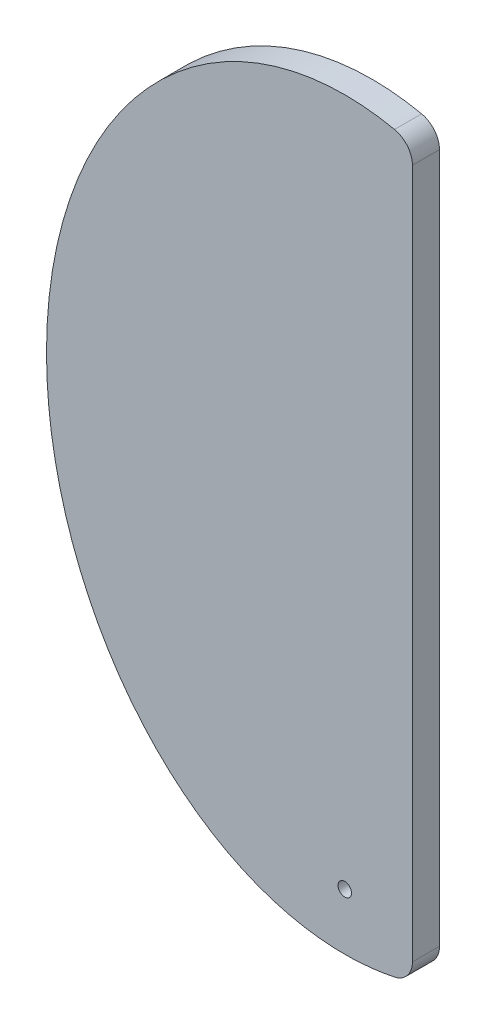
ISO-10303-21;
HEADER;
FILE_DESCRIPTION(('STEP AP214'),'2;1');
FILE_NAME('part.step','',(''),(''),'','','');
FILE_SCHEMA(('AUTOMOTIVE_DESIGN { 1 0 10303 214 1 1 1 1 }'));
ENDSEC;
DATA;
#1=APPLICATION_CONTEXT('core data for automotive mechanical design processes');
#2=APPLICATION_PROTOCOL_DEFINITION('international standard','automotive_design',2000,#1);
#3=PRODUCT_CONTEXT('',#1,'mechanical');
#4=PRODUCT('Part','Part','',(#3));
#5=PRODUCT_RELATED_PRODUCT_CATEGORY('part','',(#4));
#6=PRODUCT_DEFINITION_FORMATION('','',#4);
#7=PRODUCT_DEFINITION_CONTEXT('part definition',#1,'design');
#8=PRODUCT_DEFINITION('design','',#6,#7);
#9=PRODUCT_DEFINITION_SHAPE('','',#8);
#10=(LENGTH_UNIT() NAMED_UNIT(*) SI_UNIT(.MILLI.,.METRE.));
#11=(NAMED_UNIT(*) PLANE_ANGLE_UNIT() SI_UNIT($,.RADIAN.));
#12=(NAMED_UNIT(*) SI_UNIT($,.STERADIAN.) SOLID_ANGLE_UNIT());
#13=UNCERTAINTY_MEASURE_WITH_UNIT(LENGTH_MEASURE(1.E-05),#10,'distance_accuracy_value','');
#14=(GEOMETRIC_REPRESENTATION_CONTEXT(3) GLOBAL_UNCERTAINTY_ASSIGNED_CONTEXT((#13)) GLOBAL_UNIT_ASSIGNED_CONTEXT((#10,
#11,#12)) REPRESENTATION_CONTEXT('',''));
#15=CARTESIAN_POINT('',(0.,0.,0.));
#16=DIRECTION('',(0.,0.,1.));
#17=DIRECTION('',(1.,0.,0.));
#18=AXIS2_PLACEMENT_3D('',#15,#16,#17);
#19=CARTESIAN_POINT('',(0.,0.,6.));
#20=DIRECTION('',(0.,0.,1.));
#21=DIRECTION('',(1.,0.,0.));
#22=AXIS2_PLACEMENT_3D('',#19,#20,#21);
#23=PLANE('',#22);
#24=DIRECTION('',(0.,-1.,0.));
#25=VECTOR('',#24,1.);
#26=CARTESIAN_POINT('',(15.,-139.2756568236,6.));
#27=LINE('',#26,#25);
#28=CARTESIAN_POINT('',(15.,76.4505554366876,6.));
#29=VERTEX_POINT('',#28);
#30=CARTESIAN_POINT('',(15.,-76.4505554366876,6.));
#31=VERTEX_POINT('',#30);
#32=EDGE_CURVE('E110',#29,#31,#27,.T.);
#33=ORIENTED_EDGE('',*,*,#32,.F.);
#34=CARTESIAN_POINT('',(9.99999999999999,76.4505554366876,6.));
#35=DIRECTION('',(0.,0.,1.));
#36=DIRECTION('',(1.,0.,0.));
#37=AXIS2_PLACEMENT_3D('',#34,#35,#36);
#38=CIRCLE('',#37,5.);
#39=CARTESIAN_POINT('',(11.0336642629133,81.3425425780828,6.));
#40=VERTEX_POINT('',#39);
#41=EDGE_CURVE('E11',#29,#40,#38,.T.);
#42=ORIENTED_EDGE('',*,*,#41,.T.);
#43=CARTESIAN_POINT('',(0.,0.,6.));
#44=DIRECTION('',(0.,0.,1.));
#45=DIRECTION('',(0.,-1.,0.));
#46=AXIS2_PLACEMENT_3D('',#43,#44,#45);
#47=ELLIPSE('',#46,82.5,66.1009744717116);
#48=CARTESIAN_POINT('',(11.0336642629133,-81.3425425780828,6.));
#49=VERTEX_POINT('',#48);
#50=EDGE_CURVE('E89',#40,#49,#47,.T.);
#51=ORIENTED_EDGE('',*,*,#50,.T.);
#52=CARTESIAN_POINT('',(10.,-76.4505554366876,6.));
#53=DIRECTION('',(0.,0.,1.));
#54=DIRECTION('',(1.,0.,0.));
#55=AXIS2_PLACEMENT_3D('',#52,#53,#54);
#56=CIRCLE('',#55,5.);
#57=EDGE_CURVE('E40',#49,#31,#56,.T.);
#58=ORIENTED_EDGE('',*,*,#57,.T.);
#59=EDGE_LOOP('',(#33,#42,#51,#58));
#60=FACE_BOUND('',#59,.T.);
#61=CARTESIAN_POINT('',(0.,-70.,6.));
#62=DIRECTION('',(0.,0.,1.));
#63=DIRECTION('',(1.,0.,0.));
#64=AXIS2_PLACEMENT_3D('',#61,#62,#63);
#65=CIRCLE('',#64,1.5);
#66=CARTESIAN_POINT('',(1.50000000000002,-70.,6.));
#67=VERTEX_POINT('',#66);
#68=EDGE_CURVE('E95',#67,#67,#65,.T.);
#69=ORIENTED_EDGE('',*,*,#68,.F.);
#70=EDGE_LOOP('',(#69));
#71=FACE_BOUND('',#70,.T.);
#72=ADVANCED_FACE('F32',(#60,#71),#23,.T.);
#73=CARTESIAN_POINT('',(0.,0.,0.));
#74=DIRECTION('',(0.,0.,1.));
#75=DIRECTION('',(1.,0.,0.));
#76=AXIS2_PLACEMENT_3D('',#73,#74,#75);
#77=PLANE('',#76);
#78=CARTESIAN_POINT('',(0.,0.,0.));
#79=DIRECTION('',(0.,0.,1.));
#80=DIRECTION('',(0.,-1.,0.));
#81=AXIS2_PLACEMENT_3D('',#78,#79,#80);
#82=ELLIPSE('',#81,82.5,66.1009744717116);
#83=CARTESIAN_POINT('',(11.0336642629133,81.3425425780828,0.));
#84=VERTEX_POINT('',#83);
#85=CARTESIAN_POINT('',(11.0336642629133,-81.3425425780828,0.));
#86=VERTEX_POINT('',#85);
#87=EDGE_CURVE('E87',#84,#86,#82,.T.);
#88=ORIENTED_EDGE('',*,*,#87,.F.);
#89=CARTESIAN_POINT('',(9.99999999999999,76.4505554366876,0.));
#90=DIRECTION('',(0.,0.,1.));
#91=DIRECTION('',(1.,0.,0.));
#92=AXIS2_PLACEMENT_3D('',#89,#90,#91);
#93=CIRCLE('',#92,5.);
#94=CARTESIAN_POINT('',(15.,76.4505554366876,0.));
#95=VERTEX_POINT('',#94);
#96=EDGE_CURVE('E71',#84,#95,#93,.F.);
#97=ORIENTED_EDGE('',*,*,#96,.T.);
#98=DIRECTION('',(0.,-1.,0.));
#99=VECTOR('',#98,1.);
#100=CARTESIAN_POINT('',(15.,0.,0.));
#101=LINE('',#100,#99);
#102=CARTESIAN_POINT('',(15.,-76.4505554366876,0.));
#103=VERTEX_POINT('',#102);
#104=EDGE_CURVE('E109',#95,#103,#101,.T.);
#105=ORIENTED_EDGE('',*,*,#104,.T.);
#106=CARTESIAN_POINT('',(10.,-76.4505554366876,0.));
#107=DIRECTION('',(0.,0.,1.));
#108=DIRECTION('',(1.,0.,0.));
#109=AXIS2_PLACEMENT_3D('',#106,#107,#108);
#110=CIRCLE('',#109,5.);
#111=EDGE_CURVE('E80',#103,#86,#110,.F.);
#112=ORIENTED_EDGE('',*,*,#111,.T.);
#113=EDGE_LOOP('',(#88,#97,#105,#112));
#114=FACE_BOUND('',#113,.T.);
#115=CARTESIAN_POINT('',(0.,-70.,0.));
#116=DIRECTION('',(0.,0.,1.));
#117=DIRECTION('',(1.,0.,0.));
#118=AXIS2_PLACEMENT_3D('',#115,#116,#117);
#119=CIRCLE('',#118,1.5);
#120=CARTESIAN_POINT('',(1.50000000000002,-70.,0.));
#121=VERTEX_POINT('',#120);
#122=EDGE_CURVE('E99',#121,#121,#119,.T.);
#123=ORIENTED_EDGE('',*,*,#122,.T.);
#124=EDGE_LOOP('',(#123));
#125=FACE_BOUND('',#124,.T.);
#126=ADVANCED_FACE('F92',(#114,#125),#77,.F.);
#127=DIRECTION('',(0.,0.,-1.));
#128=VECTOR('',#127,1.);
#129=SURFACE_OF_LINEAR_EXTRUSION('',#47,#128);
#130=ORIENTED_EDGE('',*,*,#50,.F.);
#131=DIRECTION('',(0.,0.,-1.));
#132=VECTOR('',#131,1.);
#133=CARTESIAN_POINT('',(11.0336642629133,81.3425425780828,6.));
#134=LINE('',#133,#132);
#135=EDGE_CURVE('E75',#40,#84,#134,.T.);
#136=ORIENTED_EDGE('',*,*,#135,.T.);
#137=ORIENTED_EDGE('',*,*,#87,.T.);
#138=DIRECTION('',(0.,0.,-1.));
#139=VECTOR('',#138,1.);
#140=CARTESIAN_POINT('',(11.0336642629133,-81.3425425780828,0.));
#141=LINE('',#140,#139);
#142=EDGE_CURVE('E90',#86,#49,#141,.F.);
#143=ORIENTED_EDGE('',*,*,#142,.T.);
#144=EDGE_LOOP('',(#130,#136,#137,#143));
#145=FACE_BOUND('',#144,.T.);
#146=ADVANCED_FACE('F85',(#145),#129,.F.);
#147=CARTESIAN_POINT('',(0.,-70.,6.));
#148=DIRECTION('',(0.,0.,-1.));
#149=DIRECTION('',(-1.,0.,0.));
#150=AXIS2_PLACEMENT_3D('',#147,#148,#149);
#151=CYLINDRICAL_SURFACE('',#150,1.5);
#152=ORIENTED_EDGE('',*,*,#68,.T.);
#153=EDGE_LOOP('',(#152));
#154=FACE_BOUND('',#153,.T.);
#155=ORIENTED_EDGE('',*,*,#122,.F.);
#156=EDGE_LOOP('',(#155));
#157=FACE_BOUND('',#156,.T.);
#158=ADVANCED_FACE('F118',(#154,#157),#151,.F.);
#159=CARTESIAN_POINT('',(15.,-139.2756568236,-4.));
#160=DIRECTION('',(-1.,0.,0.));
#161=DIRECTION('',(0.,0.,1.));
#162=AXIS2_PLACEMENT_3D('',#159,#160,#161);
#163=PLANE('',#162);
#164=ORIENTED_EDGE('',*,*,#104,.F.);
#165=DIRECTION('',(0.,0.,-1.));
#166=VECTOR('',#165,1.);
#167=CARTESIAN_POINT('',(15.,76.4505554366876,-4.));
#168=LINE('',#167,#166);
#169=EDGE_CURVE('E53',#95,#29,#168,.F.);
#170=ORIENTED_EDGE('',*,*,#169,.T.);
#171=ORIENTED_EDGE('',*,*,#32,.T.);
#172=DIRECTION('',(0.,0.,-1.));
#173=VECTOR('',#172,1.);
#174=CARTESIAN_POINT('',(15.,-76.4505554366876,-4.));
#175=LINE('',#174,#173);
#176=EDGE_CURVE('E79',#31,#103,#175,.T.);
#177=ORIENTED_EDGE('',*,*,#176,.T.);
#178=EDGE_LOOP('',(#164,#170,#171,#177));
#179=FACE_BOUND('',#178,.T.);
#180=ADVANCED_FACE('F108',(#179),#163,.F.);
#181=CARTESIAN_POINT('',(9.99999999999999,76.4505554366876,3.));
#182=DIRECTION('',(0.,0.,-1.));
#183=DIRECTION('',(-1.,0.,0.));
#184=AXIS2_PLACEMENT_3D('',#181,#182,#183);
#185=CYLINDRICAL_SURFACE('',#184,5.);
#186=ORIENTED_EDGE('',*,*,#41,.F.);
#187=ORIENTED_EDGE('',*,*,#169,.F.);
#188=ORIENTED_EDGE('',*,*,#96,.F.);
#189=ORIENTED_EDGE('',*,*,#135,.F.);
#190=EDGE_LOOP('',(#186,#187,#188,#189));
#191=FACE_BOUND('',#190,.T.);
#192=ADVANCED_FACE('F74',(#191),#185,.T.);
#193=CARTESIAN_POINT('',(10.,-76.4505554366876,3.));
#194=DIRECTION('',(0.,0.,-1.));
#195=DIRECTION('',(-1.,0.,0.));
#196=AXIS2_PLACEMENT_3D('',#193,#194,#195);
#197=CYLINDRICAL_SURFACE('',#196,5.);
#198=ORIENTED_EDGE('',*,*,#111,.F.);
#199=ORIENTED_EDGE('',*,*,#176,.F.);
#200=ORIENTED_EDGE('',*,*,#57,.F.);
#201=ORIENTED_EDGE('',*,*,#142,.F.);
#202=EDGE_LOOP('',(#198,#199,#200,#201));
#203=FACE_BOUND('',#202,.T.);
#204=ADVANCED_FACE('F34',(#203),#197,.T.);
#205=CLOSED_SHELL('',(#72,#126,#146,#158,#180,#192,#204));
#206=MANIFOLD_SOLID_BREP('B2',#205);
#207=ADVANCED_BREP_SHAPE_REPRESENTATION('',(#18,#206),#14);
#208=SHAPE_DEFINITION_REPRESENTATION(#9,#207);
ENDSEC;
END-ISO-10303-21;
